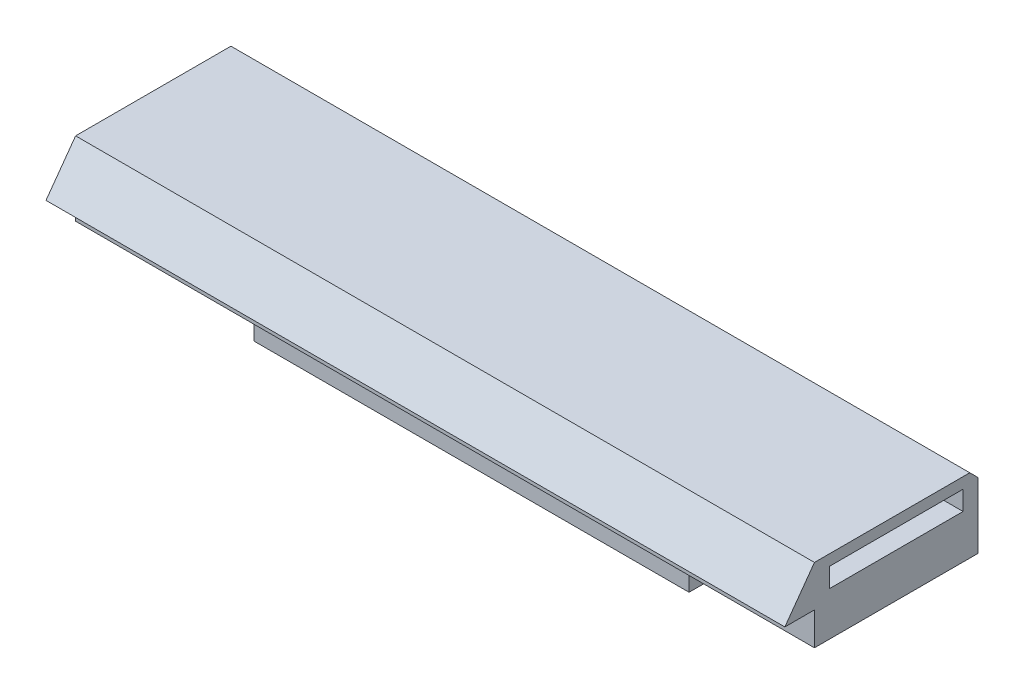
ISO-10303-21;
HEADER;
FILE_DESCRIPTION(('STEP AP214'),'2;1');
FILE_NAME('part.step','',(''),(''),'','','');
FILE_SCHEMA(('AUTOMOTIVE_DESIGN { 1 0 10303 214 1 1 1 1 }'));
ENDSEC;
DATA;
#1=APPLICATION_CONTEXT('core data for automotive mechanical design processes');
#2=APPLICATION_PROTOCOL_DEFINITION('international standard','automotive_design',2000,#1);
#3=PRODUCT_CONTEXT('',#1,'mechanical');
#4=PRODUCT('Part','Part','',(#3));
#5=PRODUCT_RELATED_PRODUCT_CATEGORY('part','',(#4));
#6=PRODUCT_DEFINITION_FORMATION('','',#4);
#7=PRODUCT_DEFINITION_CONTEXT('part definition',#1,'design');
#8=PRODUCT_DEFINITION('design','',#6,#7);
#9=PRODUCT_DEFINITION_SHAPE('','',#8);
#10=(LENGTH_UNIT() NAMED_UNIT(*) SI_UNIT(.MILLI.,.METRE.));
#11=(NAMED_UNIT(*) PLANE_ANGLE_UNIT() SI_UNIT($,.RADIAN.));
#12=(NAMED_UNIT(*) SI_UNIT($,.STERADIAN.) SOLID_ANGLE_UNIT());
#13=UNCERTAINTY_MEASURE_WITH_UNIT(LENGTH_MEASURE(1.E-05),#10,'distance_accuracy_value','');
#14=(GEOMETRIC_REPRESENTATION_CONTEXT(3) GLOBAL_UNCERTAINTY_ASSIGNED_CONTEXT((#13)) GLOBAL_UNIT_ASSIGNED_CONTEXT((#10,
#11,#12)) REPRESENTATION_CONTEXT('',''));
#15=CARTESIAN_POINT('',(0.,0.,0.));
#16=DIRECTION('',(0.,0.,1.));
#17=DIRECTION('',(1.,0.,0.));
#18=AXIS2_PLACEMENT_3D('',#15,#16,#17);
#19=CARTESIAN_POINT('',(-4.405,0.632503647479849,-0.81345422005245));
#20=DIRECTION('',(0.,0.,-1.));
#21=DIRECTION('',(-1.,0.,0.));
#22=AXIS2_PLACEMENT_3D('',#19,#20,#21);
#23=PLANE('',#22);
#24=DIRECTION('',(1.,0.,0.));
#25=VECTOR('',#24,1.);
#26=CARTESIAN_POINT('',(-4.405,0.867496352520151,-0.81345422005245));
#27=LINE('',#26,#25);
#28=CARTESIAN_POINT('',(2.3733449145523,0.867496352520151,-0.81345422005245));
#29=VERTEX_POINT('',#28);
#30=CARTESIAN_POINT('',(4.495,0.867496352520151,-0.81345422005245));
#31=VERTEX_POINT('',#30);
#32=EDGE_CURVE('E240',#29,#31,#27,.T.);
#33=ORIENTED_EDGE('',*,*,#32,.F.);
#34=DIRECTION('',(0.,-1.,0.));
#35=VECTOR('',#34,1.);
#36=CARTESIAN_POINT('',(2.3733449145523,0.632503647479849,-0.81345422005245));
#37=LINE('',#36,#35);
#38=CARTESIAN_POINT('',(2.3733449145523,0.632503647479849,-0.81345422005245));
#39=VERTEX_POINT('',#38);
#40=EDGE_CURVE('E486',#29,#39,#37,.T.);
#41=ORIENTED_EDGE('',*,*,#40,.T.);
#42=DIRECTION('',(1.,0.,0.));
#43=VECTOR('',#42,1.);
#44=CARTESIAN_POINT('',(-4.405,0.632503647479849,-0.81345422005245));
#45=LINE('',#44,#43);
#46=CARTESIAN_POINT('',(4.495,0.632503647479849,-0.81345422005245));
#47=VERTEX_POINT('',#46);
#48=EDGE_CURVE('E427',#39,#47,#45,.T.);
#49=ORIENTED_EDGE('',*,*,#48,.T.);
#50=DIRECTION('',(0.,1.,0.));
#51=VECTOR('',#50,1.);
#52=CARTESIAN_POINT('',(4.495,0.632503647479849,-0.81345422005245));
#53=LINE('',#52,#51);
#54=EDGE_CURVE('E456',#47,#31,#53,.T.);
#55=ORIENTED_EDGE('',*,*,#54,.T.);
#56=EDGE_LOOP('',(#33,#41,#49,#55));
#57=FACE_BOUND('',#56,.T.);
#58=ADVANCED_FACE('F42',(#57),#23,.F.);
#59=CARTESIAN_POINT('',(-4.405,0.632503647479849,0.81345422005245));
#60=DIRECTION('',(0.,-1.,0.));
#61=DIRECTION('',(0.,0.,-1.));
#62=AXIS2_PLACEMENT_3D('',#59,#60,#61);
#63=PLANE('',#62);
#64=ORIENTED_EDGE('',*,*,#48,.F.);
#65=DIRECTION('',(0.,0.,1.));
#66=VECTOR('',#65,1.);
#67=CARTESIAN_POINT('',(2.3733449145523,0.632503647479849,0.81345422005245));
#68=LINE('',#67,#66);
#69=CARTESIAN_POINT('',(2.3733449145523,0.632503647479849,0.81345422005245));
#70=VERTEX_POINT('',#69);
#71=EDGE_CURVE('E490',#39,#70,#68,.T.);
#72=ORIENTED_EDGE('',*,*,#71,.T.);
#73=DIRECTION('',(1.,0.,0.));
#74=VECTOR('',#73,1.);
#75=CARTESIAN_POINT('',(-4.405,0.632503647479849,0.81345422005245));
#76=LINE('',#75,#74);
#77=CARTESIAN_POINT('',(4.495,0.632503647479849,0.81345422005245));
#78=VERTEX_POINT('',#77);
#79=EDGE_CURVE('E433',#70,#78,#76,.T.);
#80=ORIENTED_EDGE('',*,*,#79,.T.);
#81=DIRECTION('',(0.,0.,-1.));
#82=VECTOR('',#81,1.);
#83=CARTESIAN_POINT('',(4.495,0.632503647479849,0.81345422005245));
#84=LINE('',#83,#82);
#85=EDGE_CURVE('E450',#78,#47,#84,.T.);
#86=ORIENTED_EDGE('',*,*,#85,.T.);
#87=EDGE_LOOP('',(#64,#72,#80,#86));
#88=FACE_BOUND('',#87,.T.);
#89=ADVANCED_FACE('F475',(#88),#63,.F.);
#90=CARTESIAN_POINT('',(-4.405,0.632503647479849,0.81345422005245));
#91=DIRECTION('',(0.,0.,1.));
#92=DIRECTION('',(1.,0.,0.));
#93=AXIS2_PLACEMENT_3D('',#90,#91,#92);
#94=PLANE('',#93);
#95=ORIENTED_EDGE('',*,*,#79,.F.);
#96=DIRECTION('',(0.,1.,0.));
#97=VECTOR('',#96,1.);
#98=CARTESIAN_POINT('',(2.3733449145523,0.632503647479849,0.81345422005245));
#99=LINE('',#98,#97);
#100=CARTESIAN_POINT('',(2.3733449145523,0.867496352520151,0.81345422005245));
#101=VERTEX_POINT('',#100);
#102=EDGE_CURVE('E231',#70,#101,#99,.T.);
#103=ORIENTED_EDGE('',*,*,#102,.T.);
#104=DIRECTION('',(1.,0.,0.));
#105=VECTOR('',#104,1.);
#106=CARTESIAN_POINT('',(-4.405,0.867496352520151,0.81345422005245));
#107=LINE('',#106,#105);
#108=CARTESIAN_POINT('',(4.495,0.867496352520151,0.81345422005245));
#109=VERTEX_POINT('',#108);
#110=EDGE_CURVE('E239',#101,#109,#107,.T.);
#111=ORIENTED_EDGE('',*,*,#110,.T.);
#112=DIRECTION('',(0.,-1.,0.));
#113=VECTOR('',#112,1.);
#114=CARTESIAN_POINT('',(4.495,0.632503647479849,0.81345422005245));
#115=LINE('',#114,#113);
#116=EDGE_CURVE('E465',#109,#78,#115,.T.);
#117=ORIENTED_EDGE('',*,*,#116,.T.);
#118=EDGE_LOOP('',(#95,#103,#111,#117));
#119=FACE_BOUND('',#118,.T.);
#120=ADVANCED_FACE('F565',(#119),#94,.F.);
#121=CARTESIAN_POINT('',(-4.405,0.867496352520151,0.81345422005245));
#122=DIRECTION('',(0.,1.,0.));
#123=DIRECTION('',(0.,0.,1.));
#124=AXIS2_PLACEMENT_3D('',#121,#122,#123);
#125=PLANE('',#124);
#126=ORIENTED_EDGE('',*,*,#110,.F.);
#127=DIRECTION('',(0.,0.,-1.));
#128=VECTOR('',#127,1.);
#129=CARTESIAN_POINT('',(2.3733449145523,0.867496352520151,0.81345422005245));
#130=LINE('',#129,#128);
#131=EDGE_CURVE('E220',#101,#29,#130,.T.);
#132=ORIENTED_EDGE('',*,*,#131,.T.);
#133=ORIENTED_EDGE('',*,*,#32,.T.);
#134=DIRECTION('',(0.,0.,1.));
#135=VECTOR('',#134,1.);
#136=CARTESIAN_POINT('',(4.495,0.867496352520151,0.81345422005245));
#137=LINE('',#136,#135);
#138=EDGE_CURVE('E460',#31,#109,#137,.T.);
#139=ORIENTED_EDGE('',*,*,#138,.T.);
#140=EDGE_LOOP('',(#126,#132,#133,#139));
#141=FACE_BOUND('',#140,.T.);
#142=ADVANCED_FACE('F583',(#141),#125,.F.);
#143=CARTESIAN_POINT('',(-4.495,1.,0.995));
#144=DIRECTION('',(0.,0.,-1.));
#145=DIRECTION('',(-1.,0.,0.));
#146=AXIS2_PLACEMENT_3D('',#143,#144,#145);
#147=PLANE('',#146);
#148=DIRECTION('',(0.,-1.,0.));
#149=VECTOR('',#148,1.);
#150=CARTESIAN_POINT('',(-4.495,1.,0.995));
#151=LINE('',#150,#149);
#152=CARTESIAN_POINT('',(-4.495,0.5,0.995));
#153=VERTEX_POINT('',#152);
#154=CARTESIAN_POINT('',(-4.495,0.1,0.995));
#155=VERTEX_POINT('',#154);
#156=EDGE_CURVE('E285',#153,#155,#151,.T.);
#157=ORIENTED_EDGE('',*,*,#156,.T.);
#158=DIRECTION('',(1.,0.,0.));
#159=VECTOR('',#158,1.);
#160=CARTESIAN_POINT('',(4.495,0.1,0.995));
#161=LINE('',#160,#159);
#162=CARTESIAN_POINT('',(4.495,0.1,0.995));
#163=VERTEX_POINT('',#162);
#164=EDGE_CURVE('E369',#155,#163,#161,.T.);
#165=ORIENTED_EDGE('',*,*,#164,.T.);
#166=DIRECTION('',(0.,-1.,0.));
#167=VECTOR('',#166,1.);
#168=CARTESIAN_POINT('',(4.495,1.,0.995));
#169=LINE('',#168,#167);
#170=CARTESIAN_POINT('',(4.495,0.5,0.995));
#171=VERTEX_POINT('',#170);
#172=EDGE_CURVE('E281',#171,#163,#169,.T.);
#173=ORIENTED_EDGE('',*,*,#172,.F.);
#174=DIRECTION('',(1.,0.,0.));
#175=VECTOR('',#174,1.);
#176=CARTESIAN_POINT('',(-4.495,0.5,0.995));
#177=LINE('',#176,#175);
#178=EDGE_CURVE('E266',#153,#171,#177,.T.);
#179=ORIENTED_EDGE('',*,*,#178,.F.);
#180=EDGE_LOOP('',(#157,#165,#173,#179));
#181=FACE_BOUND('',#180,.T.);
#182=ADVANCED_FACE('F596',(#181),#147,.F.);
#183=CARTESIAN_POINT('',(4.495,1.,0.995));
#184=DIRECTION('',(-1.,0.,0.));
#185=DIRECTION('',(0.,0.,1.));
#186=AXIS2_PLACEMENT_3D('',#183,#184,#185);
#187=PLANE('',#186);
#188=ORIENTED_EDGE('',*,*,#138,.F.);
#189=ORIENTED_EDGE('',*,*,#54,.F.);
#190=ORIENTED_EDGE('',*,*,#85,.F.);
#191=ORIENTED_EDGE('',*,*,#116,.F.);
#192=EDGE_LOOP('',(#188,#189,#190,#191));
#193=FACE_BOUND('',#192,.T.);
#194=DIRECTION('',(0.,-1.,0.));
#195=VECTOR('',#194,1.);
#196=CARTESIAN_POINT('',(4.495,1.,-0.995));
#197=LINE('',#196,#195);
#198=CARTESIAN_POINT('',(4.495,0.899999999999999,-0.995));
#199=VERTEX_POINT('',#198);
#200=CARTESIAN_POINT('',(4.495,0.1,-0.995));
#201=VERTEX_POINT('',#200);
#202=EDGE_CURVE('E221',#199,#201,#197,.T.);
#203=ORIENTED_EDGE('',*,*,#202,.F.);
#204=DIRECTION('',(0.,-0.707106781186548,-0.707106781186548));
#205=VECTOR('',#204,1.);
#206=CARTESIAN_POINT('',(4.495,1.,-0.894999999999999));
#207=LINE('',#206,#205);
#208=CARTESIAN_POINT('',(4.495,1.,-0.894999999999999));
#209=VERTEX_POINT('',#208);
#210=EDGE_CURVE('E11',#199,#209,#207,.F.);
#211=ORIENTED_EDGE('',*,*,#210,.T.);
#212=DIRECTION('',(0.,0.,-1.));
#213=VECTOR('',#212,1.);
#214=CARTESIAN_POINT('',(4.495,1.,0.995));
#215=LINE('',#214,#213);
#216=CARTESIAN_POINT('',(4.495,1.,0.995));
#217=VERTEX_POINT('',#216);
#218=EDGE_CURVE('E269',#217,#209,#215,.T.);
#219=ORIENTED_EDGE('',*,*,#218,.F.);
#220=DIRECTION('',(0.,-0.811516181908999,0.584329946605376));
#221=VECTOR('',#220,1.);
#222=CARTESIAN_POINT('',(4.495,0.5,1.3550235951123));
#223=LINE('',#222,#221);
#224=CARTESIAN_POINT('',(4.495,0.5,1.3550235951123));
#225=VERTEX_POINT('',#224);
#226=EDGE_CURVE('E259',#217,#225,#223,.T.);
#227=ORIENTED_EDGE('',*,*,#226,.T.);
#228=DIRECTION('',(0.,0.,-1.));
#229=VECTOR('',#228,1.);
#230=CARTESIAN_POINT('',(4.495,0.5,0.995));
#231=LINE('',#230,#229);
#232=EDGE_CURVE('E254',#225,#171,#231,.T.);
#233=ORIENTED_EDGE('',*,*,#232,.T.);
#234=ORIENTED_EDGE('',*,*,#172,.T.);
#235=DIRECTION('',(0.,0.,-1.));
#236=VECTOR('',#235,1.);
#237=CARTESIAN_POINT('',(4.495,0.1,-0.995));
#238=LINE('',#237,#236);
#239=EDGE_CURVE('E372',#163,#201,#238,.T.);
#240=ORIENTED_EDGE('',*,*,#239,.T.);
#241=EDGE_LOOP('',(#203,#211,#219,#227,#233,#234,#240));
#242=FACE_BOUND('',#241,.T.);
#243=ADVANCED_FACE('F481',(#193,#242),#187,.F.);
#244=CARTESIAN_POINT('',(-4.495,1.,-0.995));
#245=DIRECTION('',(0.,0.,1.));
#246=DIRECTION('',(1.,0.,0.));
#247=AXIS2_PLACEMENT_3D('',#244,#245,#246);
#248=PLANE('',#247);
#249=DIRECTION('',(0.,-1.,0.));
#250=VECTOR('',#249,1.);
#251=CARTESIAN_POINT('',(-4.495,1.,-0.995));
#252=LINE('',#251,#250);
#253=CARTESIAN_POINT('',(-4.495,0.899999999999999,-0.995));
#254=VERTEX_POINT('',#253);
#255=CARTESIAN_POINT('',(-4.495,0.1,-0.995));
#256=VERTEX_POINT('',#255);
#257=EDGE_CURVE('E289',#254,#256,#252,.T.);
#258=ORIENTED_EDGE('',*,*,#257,.F.);
#259=DIRECTION('',(1.,0.,0.));
#260=VECTOR('',#259,1.);
#261=CARTESIAN_POINT('',(-4.495,0.899999999999999,-0.995));
#262=LINE('',#261,#260);
#263=EDGE_CURVE('E53',#254,#199,#262,.T.);
#264=ORIENTED_EDGE('',*,*,#263,.T.);
#265=ORIENTED_EDGE('',*,*,#202,.T.);
#266=DIRECTION('',(-1.,0.,0.));
#267=VECTOR('',#266,1.);
#268=CARTESIAN_POINT('',(-4.495,0.1,-0.995));
#269=LINE('',#268,#267);
#270=EDGE_CURVE('E336',#201,#256,#269,.T.);
#271=ORIENTED_EDGE('',*,*,#270,.T.);
#272=EDGE_LOOP('',(#258,#264,#265,#271));
#273=FACE_BOUND('',#272,.T.);
#274=ADVANCED_FACE('F660',(#273),#248,.F.);
#275=CARTESIAN_POINT('',(-4.495,1.,0.995));
#276=DIRECTION('',(1.,0.,0.));
#277=DIRECTION('',(0.,0.,-1.));
#278=AXIS2_PLACEMENT_3D('',#275,#276,#277);
#279=PLANE('',#278);
#280=DIRECTION('',(0.,0.,1.));
#281=VECTOR('',#280,1.);
#282=CARTESIAN_POINT('',(-4.495,1.,0.995));
#283=LINE('',#282,#281);
#284=CARTESIAN_POINT('',(-4.495,1.,-0.894999999999999));
#285=VERTEX_POINT('',#284);
#286=CARTESIAN_POINT('',(-4.495,1.,0.995));
#287=VERTEX_POINT('',#286);
#288=EDGE_CURVE('E275',#285,#287,#283,.T.);
#289=ORIENTED_EDGE('',*,*,#288,.F.);
#290=DIRECTION('',(0.,0.707106781186548,0.707106781186548));
#291=VECTOR('',#290,1.);
#292=CARTESIAN_POINT('',(-4.495,1.,-0.894999999999999));
#293=LINE('',#292,#291);
#294=EDGE_CURVE('E67',#285,#254,#293,.F.);
#295=ORIENTED_EDGE('',*,*,#294,.T.);
#296=ORIENTED_EDGE('',*,*,#257,.T.);
#297=DIRECTION('',(0.,0.,1.));
#298=VECTOR('',#297,1.);
#299=CARTESIAN_POINT('',(-4.495,0.1,0.995));
#300=LINE('',#299,#298);
#301=EDGE_CURVE('E366',#256,#155,#300,.T.);
#302=ORIENTED_EDGE('',*,*,#301,.T.);
#303=ORIENTED_EDGE('',*,*,#156,.F.);
#304=DIRECTION('',(0.,0.,-1.));
#305=VECTOR('',#304,1.);
#306=CARTESIAN_POINT('',(-4.495,0.5,0.995));
#307=LINE('',#306,#305);
#308=CARTESIAN_POINT('',(-4.495,0.5,1.3550235951123));
#309=VERTEX_POINT('',#308);
#310=EDGE_CURVE('E253',#309,#153,#307,.T.);
#311=ORIENTED_EDGE('',*,*,#310,.F.);
#312=DIRECTION('',(0.,-0.811516181908999,0.584329946605376));
#313=VECTOR('',#312,1.);
#314=CARTESIAN_POINT('',(-4.495,0.5,1.3550235951123));
#315=LINE('',#314,#313);
#316=EDGE_CURVE('E249',#287,#309,#315,.T.);
#317=ORIENTED_EDGE('',*,*,#316,.F.);
#318=EDGE_LOOP('',(#289,#295,#296,#302,#303,#311,#317));
#319=FACE_BOUND('',#318,.T.);
#320=ADVANCED_FACE('F556',(#319),#279,.F.);
#321=CARTESIAN_POINT('',(0.,1.,0.));
#322=DIRECTION('',(0.,-1.,0.));
#323=DIRECTION('',(0.,0.,-1.));
#324=AXIS2_PLACEMENT_3D('',#321,#322,#323);
#325=PLANE('',#324);
#326=ORIENTED_EDGE('',*,*,#218,.T.);
#327=DIRECTION('',(-1.,0.,0.));
#328=VECTOR('',#327,1.);
#329=CARTESIAN_POINT('',(0.,1.,-0.894999999999999));
#330=LINE('',#329,#328);
#331=EDGE_CURVE('E376',#209,#285,#330,.T.);
#332=ORIENTED_EDGE('',*,*,#331,.T.);
#333=ORIENTED_EDGE('',*,*,#288,.T.);
#334=DIRECTION('',(1.,0.,0.));
#335=VECTOR('',#334,1.);
#336=CARTESIAN_POINT('',(-4.495,1.,0.995));
#337=LINE('',#336,#335);
#338=EDGE_CURVE('E278',#287,#217,#337,.T.);
#339=ORIENTED_EDGE('',*,*,#338,.T.);
#340=EDGE_LOOP('',(#326,#332,#333,#339));
#341=FACE_BOUND('',#340,.T.);
#342=ADVANCED_FACE('F546',(#341),#325,.F.);
#343=CARTESIAN_POINT('',(0.,0.,0.));
#344=DIRECTION('',(0.,-1.,0.));
#345=DIRECTION('',(0.,0.,-1.));
#346=AXIS2_PLACEMENT_3D('',#343,#344,#345);
#347=PLANE('',#346);
#348=DIRECTION('',(0.,0.,-1.));
#349=VECTOR('',#348,1.);
#350=CARTESIAN_POINT('',(-4.395,0.,-0.995));
#351=LINE('',#350,#349);
#352=CARTESIAN_POINT('',(-4.395,0.,0.895));
#353=VERTEX_POINT('',#352);
#354=CARTESIAN_POINT('',(-4.395,0.,-0.895));
#355=VERTEX_POINT('',#354);
#356=EDGE_CURVE('E359',#353,#355,#351,.T.);
#357=ORIENTED_EDGE('',*,*,#356,.T.);
#358=DIRECTION('',(1.,0.,0.));
#359=VECTOR('',#358,1.);
#360=CARTESIAN_POINT('',(4.495,0.,-0.895));
#361=LINE('',#360,#359);
#362=CARTESIAN_POINT('',(4.395,0.,-0.895));
#363=VERTEX_POINT('',#362);
#364=EDGE_CURVE('E362',#355,#363,#361,.T.);
#365=ORIENTED_EDGE('',*,*,#364,.T.);
#366=DIRECTION('',(0.,0.,1.));
#367=VECTOR('',#366,1.);
#368=CARTESIAN_POINT('',(4.395,0.,0.995));
#369=LINE('',#368,#367);
#370=CARTESIAN_POINT('',(4.395,0.,0.895));
#371=VERTEX_POINT('',#370);
#372=EDGE_CURVE('E353',#363,#371,#369,.T.);
#373=ORIENTED_EDGE('',*,*,#372,.T.);
#374=DIRECTION('',(-1.,0.,0.));
#375=VECTOR('',#374,1.);
#376=CARTESIAN_POINT('',(-4.495,0.,0.895));
#377=LINE('',#376,#375);
#378=EDGE_CURVE('E356',#371,#353,#377,.T.);
#379=ORIENTED_EDGE('',*,*,#378,.T.);
#380=EDGE_LOOP('',(#357,#365,#373,#379));
#381=FACE_BOUND('',#380,.T.);
#382=DIRECTION('',(0.,0.,1.));
#383=VECTOR('',#382,1.);
#384=CARTESIAN_POINT('',(-2.74685589781037,0.,0.));
#385=LINE('',#384,#383);
#386=CARTESIAN_POINT('',(-2.74685589781037,0.,-0.77245516157822));
#387=VERTEX_POINT('',#386);
#388=CARTESIAN_POINT('',(-2.74685589781037,0.,0.77245516157822));
#389=VERTEX_POINT('',#388);
#390=EDGE_CURVE('E346',#387,#389,#385,.T.);
#391=ORIENTED_EDGE('',*,*,#390,.T.);
#392=DIRECTION('',(1.,0.,0.));
#393=VECTOR('',#392,1.);
#394=CARTESIAN_POINT('',(0.,0.,0.77245516157822));
#395=LINE('',#394,#393);
#396=CARTESIAN_POINT('',(2.74685589781037,0.,0.77245516157822));
#397=VERTEX_POINT('',#396);
#398=EDGE_CURVE('E349',#389,#397,#395,.T.);
#399=ORIENTED_EDGE('',*,*,#398,.T.);
#400=DIRECTION('',(0.,0.,-1.));
#401=VECTOR('',#400,1.);
#402=CARTESIAN_POINT('',(2.74685589781037,0.,0.));
#403=LINE('',#402,#401);
#404=CARTESIAN_POINT('',(2.74685589781037,0.,-0.77245516157822));
#405=VERTEX_POINT('',#404);
#406=EDGE_CURVE('E340',#397,#405,#403,.T.);
#407=ORIENTED_EDGE('',*,*,#406,.T.);
#408=DIRECTION('',(-1.,0.,0.));
#409=VECTOR('',#408,1.);
#410=CARTESIAN_POINT('',(0.,0.,-0.77245516157822));
#411=LINE('',#410,#409);
#412=EDGE_CURVE('E343',#405,#387,#411,.T.);
#413=ORIENTED_EDGE('',*,*,#412,.T.);
#414=EDGE_LOOP('',(#391,#399,#407,#413));
#415=FACE_BOUND('',#414,.T.);
#416=ADVANCED_FACE('F543',(#381,#415),#347,.T.);
#417=CARTESIAN_POINT('',(-4.495,0.5,0.995));
#418=DIRECTION('',(0.,-1.,0.));
#419=DIRECTION('',(0.,0.,-1.));
#420=AXIS2_PLACEMENT_3D('',#417,#418,#419);
#421=PLANE('',#420);
#422=ORIENTED_EDGE('',*,*,#232,.F.);
#423=DIRECTION('',(1.,0.,0.));
#424=VECTOR('',#423,1.);
#425=CARTESIAN_POINT('',(-4.495,0.5,1.3550235951123));
#426=LINE('',#425,#424);
#427=EDGE_CURVE('E258',#309,#225,#426,.T.);
#428=ORIENTED_EDGE('',*,*,#427,.F.);
#429=ORIENTED_EDGE('',*,*,#310,.T.);
#430=ORIENTED_EDGE('',*,*,#178,.T.);
#431=EDGE_LOOP('',(#422,#428,#429,#430));
#432=FACE_BOUND('',#431,.T.);
#433=ADVANCED_FACE('F545',(#432),#421,.T.);
#434=CARTESIAN_POINT('',(-4.495,0.5,1.3550235951123));
#435=DIRECTION('',(0.,0.584329946605376,0.811516181908999));
#436=DIRECTION('',(0.,-0.811516181908999,0.584329946605376));
#437=AXIS2_PLACEMENT_3D('',#434,#435,#436);
#438=PLANE('',#437);
#439=ORIENTED_EDGE('',*,*,#226,.F.);
#440=ORIENTED_EDGE('',*,*,#338,.F.);
#441=ORIENTED_EDGE('',*,*,#316,.T.);
#442=ORIENTED_EDGE('',*,*,#427,.T.);
#443=EDGE_LOOP('',(#439,#440,#441,#442));
#444=FACE_BOUND('',#443,.T.);
#445=ADVANCED_FACE('F553',(#444),#438,.T.);
#446=CARTESIAN_POINT('',(2.64685589781037,-0.5,-0.672455161578218));
#447=DIRECTION('',(-1.,0.,0.));
#448=DIRECTION('',(0.,0.,1.));
#449=AXIS2_PLACEMENT_3D('',#446,#447,#448);
#450=PLANE('',#449);
#451=DIRECTION('',(0.,1.,0.));
#452=VECTOR('',#451,1.);
#453=CARTESIAN_POINT('',(2.64685589781037,-0.5,0.672455161578218));
#454=LINE('',#453,#452);
#455=CARTESIAN_POINT('',(2.64685589781037,-0.4,0.672455161578218));
#456=VERTEX_POINT('',#455);
#457=CARTESIAN_POINT('',(2.64685589781037,-0.100000000000002,0.672455161578218));
#458=VERTEX_POINT('',#457);
#459=EDGE_CURVE('E461',#456,#458,#454,.T.);
#460=ORIENTED_EDGE('',*,*,#459,.F.);
#461=DIRECTION('',(0.,0.,-1.));
#462=VECTOR('',#461,1.);
#463=CARTESIAN_POINT('',(2.64685589781037,-0.4,-0.672455161578218));
#464=LINE('',#463,#462);
#465=CARTESIAN_POINT('',(2.64685589781037,-0.4,-0.672455161578218));
#466=VERTEX_POINT('',#465);
#467=EDGE_CURVE('E333',#456,#466,#464,.T.);
#468=ORIENTED_EDGE('',*,*,#467,.T.);
#469=DIRECTION('',(0.,1.,0.));
#470=VECTOR('',#469,1.);
#471=CARTESIAN_POINT('',(2.64685589781037,-0.5,-0.672455161578218));
#472=LINE('',#471,#470);
#473=CARTESIAN_POINT('',(2.64685589781037,-0.100000000000002,-0.672455161578218));
#474=VERTEX_POINT('',#473);
#475=EDGE_CURVE('E489',#466,#474,#472,.T.);
#476=ORIENTED_EDGE('',*,*,#475,.T.);
#477=DIRECTION('',(0.,0.,1.));
#478=VECTOR('',#477,1.);
#479=CARTESIAN_POINT('',(2.64685589781037,-0.100000000000002,-0.672455161578218));
#480=LINE('',#479,#478);
#481=EDGE_CURVE('E330',#474,#458,#480,.T.);
#482=ORIENTED_EDGE('',*,*,#481,.T.);
#483=EDGE_LOOP('',(#460,#468,#476,#482));
#484=FACE_BOUND('',#483,.T.);
#485=ADVANCED_FACE('F585',(#484),#450,.F.);
#486=CARTESIAN_POINT('',(-2.64685589781037,-0.5,0.672455161578218));
#487=DIRECTION('',(0.,0.,-1.));
#488=DIRECTION('',(-1.,0.,0.));
#489=AXIS2_PLACEMENT_3D('',#486,#487,#488);
#490=PLANE('',#489);
#491=DIRECTION('',(0.,1.,0.));
#492=VECTOR('',#491,1.);
#493=CARTESIAN_POINT('',(-2.64685589781037,-0.5,0.672455161578218));
#494=LINE('',#493,#492);
#495=CARTESIAN_POINT('',(-2.64685589781037,-0.4,0.672455161578218));
#496=VERTEX_POINT('',#495);
#497=CARTESIAN_POINT('',(-2.64685589781037,-0.100000000000002,0.672455161578218));
#498=VERTEX_POINT('',#497);
#499=EDGE_CURVE('E503',#496,#498,#494,.T.);
#500=ORIENTED_EDGE('',*,*,#499,.F.);
#501=DIRECTION('',(1.,0.,0.));
#502=VECTOR('',#501,1.);
#503=CARTESIAN_POINT('',(-2.64685589781037,-0.4,0.672455161578218));
#504=LINE('',#503,#502);
#505=EDGE_CURVE('E327',#496,#456,#504,.T.);
#506=ORIENTED_EDGE('',*,*,#505,.T.);
#507=ORIENTED_EDGE('',*,*,#459,.T.);
#508=DIRECTION('',(-1.,0.,0.));
#509=VECTOR('',#508,1.);
#510=CARTESIAN_POINT('',(-2.64685589781037,-0.100000000000002,0.672455161578218));
#511=LINE('',#510,#509);
#512=EDGE_CURVE('E323',#458,#498,#511,.T.);
#513=ORIENTED_EDGE('',*,*,#512,.T.);
#514=EDGE_LOOP('',(#500,#506,#507,#513));
#515=FACE_BOUND('',#514,.T.);
#516=ADVANCED_FACE('F512',(#515),#490,.F.);
#517=CARTESIAN_POINT('',(-2.64685589781037,-0.5,-0.672455161578218));
#518=DIRECTION('',(1.,0.,0.));
#519=DIRECTION('',(0.,0.,-1.));
#520=AXIS2_PLACEMENT_3D('',#517,#518,#519);
#521=PLANE('',#520);
#522=DIRECTION('',(0.,1.,0.));
#523=VECTOR('',#522,1.);
#524=CARTESIAN_POINT('',(-2.64685589781037,-0.5,-0.672455161578218));
#525=LINE('',#524,#523);
#526=CARTESIAN_POINT('',(-2.64685589781037,-0.4,-0.672455161578218));
#527=VERTEX_POINT('',#526);
#528=CARTESIAN_POINT('',(-2.64685589781037,-0.100000000000002,-0.672455161578218));
#529=VERTEX_POINT('',#528);
#530=EDGE_CURVE('E495',#527,#529,#525,.T.);
#531=ORIENTED_EDGE('',*,*,#530,.F.);
#532=DIRECTION('',(0.,0.,1.));
#533=VECTOR('',#532,1.);
#534=CARTESIAN_POINT('',(-2.64685589781037,-0.4,-0.672455161578218));
#535=LINE('',#534,#533);
#536=EDGE_CURVE('E320',#527,#496,#535,.T.);
#537=ORIENTED_EDGE('',*,*,#536,.T.);
#538=ORIENTED_EDGE('',*,*,#499,.T.);
#539=DIRECTION('',(0.,0.,-1.));
#540=VECTOR('',#539,1.);
#541=CARTESIAN_POINT('',(-2.64685589781037,-0.100000000000002,-0.672455161578218));
#542=LINE('',#541,#540);
#543=EDGE_CURVE('E317',#498,#529,#542,.T.);
#544=ORIENTED_EDGE('',*,*,#543,.T.);
#545=EDGE_LOOP('',(#531,#537,#538,#544));
#546=FACE_BOUND('',#545,.T.);
#547=ADVANCED_FACE('F532',(#546),#521,.F.);
#548=CARTESIAN_POINT('',(-2.64685589781037,-0.5,-0.672455161578218));
#549=DIRECTION('',(0.,0.,1.));
#550=DIRECTION('',(1.,0.,0.));
#551=AXIS2_PLACEMENT_3D('',#548,#549,#550);
#552=PLANE('',#551);
#553=ORIENTED_EDGE('',*,*,#475,.F.);
#554=DIRECTION('',(-1.,0.,0.));
#555=VECTOR('',#554,1.);
#556=CARTESIAN_POINT('',(-2.64685589781037,-0.4,-0.672455161578218));
#557=LINE('',#556,#555);
#558=EDGE_CURVE('E313',#466,#527,#557,.T.);
#559=ORIENTED_EDGE('',*,*,#558,.T.);
#560=ORIENTED_EDGE('',*,*,#530,.T.);
#561=DIRECTION('',(1.,0.,0.));
#562=VECTOR('',#561,1.);
#563=CARTESIAN_POINT('',(-2.64685589781037,-0.100000000000002,-0.672455161578218));
#564=LINE('',#563,#562);
#565=EDGE_CURVE('E310',#529,#474,#564,.T.);
#566=ORIENTED_EDGE('',*,*,#565,.T.);
#567=EDGE_LOOP('',(#553,#559,#560,#566));
#568=FACE_BOUND('',#567,.T.);
#569=ADVANCED_FACE('F536',(#568),#552,.F.);
#570=CARTESIAN_POINT('',(0.,-0.5,0.));
#571=DIRECTION('',(0.,1.,0.));
#572=DIRECTION('',(0.,0.,1.));
#573=AXIS2_PLACEMENT_3D('',#570,#571,#572);
#574=PLANE('',#573);
#575=DIRECTION('',(0.,0.,-1.));
#576=VECTOR('',#575,1.);
#577=CARTESIAN_POINT('',(-2.54685589781037,-0.5,0.));
#578=LINE('',#577,#576);
#579=CARTESIAN_POINT('',(-2.54685589781037,-0.5,0.572455161578218));
#580=VERTEX_POINT('',#579);
#581=CARTESIAN_POINT('',(-2.54685589781037,-0.5,-0.572455161578218));
#582=VERTEX_POINT('',#581);
#583=EDGE_CURVE('E303',#580,#582,#578,.T.);
#584=ORIENTED_EDGE('',*,*,#583,.T.);
#585=DIRECTION('',(1.,0.,0.));
#586=VECTOR('',#585,1.);
#587=CARTESIAN_POINT('',(0.,-0.5,-0.572455161578218));
#588=LINE('',#587,#586);
#589=CARTESIAN_POINT('',(2.54685589781037,-0.5,-0.572455161578218));
#590=VERTEX_POINT('',#589);
#591=EDGE_CURVE('E306',#582,#590,#588,.T.);
#592=ORIENTED_EDGE('',*,*,#591,.T.);
#593=DIRECTION('',(0.,0.,1.));
#594=VECTOR('',#593,1.);
#595=CARTESIAN_POINT('',(2.54685589781037,-0.5,0.));
#596=LINE('',#595,#594);
#597=CARTESIAN_POINT('',(2.54685589781037,-0.5,0.572455161578218));
#598=VERTEX_POINT('',#597);
#599=EDGE_CURVE('E297',#590,#598,#596,.T.);
#600=ORIENTED_EDGE('',*,*,#599,.T.);
#601=DIRECTION('',(-1.,0.,0.));
#602=VECTOR('',#601,1.);
#603=CARTESIAN_POINT('',(0.,-0.5,0.572455161578218));
#604=LINE('',#603,#602);
#605=EDGE_CURVE('E300',#598,#580,#604,.T.);
#606=ORIENTED_EDGE('',*,*,#605,.T.);
#607=EDGE_LOOP('',(#584,#592,#600,#606));
#608=FACE_BOUND('',#607,.T.);
#609=ADVANCED_FACE('F608',(#608),#574,.F.);
#610=CARTESIAN_POINT('',(2.3733449145523,0.5,0.995));
#611=DIRECTION('',(1.,0.,0.));
#612=DIRECTION('',(0.,0.,-1.));
#613=AXIS2_PLACEMENT_3D('',#610,#611,#612);
#614=PLANE('',#613);
#615=ORIENTED_EDGE('',*,*,#40,.F.);
#616=ORIENTED_EDGE('',*,*,#131,.F.);
#617=ORIENTED_EDGE('',*,*,#102,.F.);
#618=ORIENTED_EDGE('',*,*,#71,.F.);
#619=EDGE_LOOP('',(#615,#616,#617,#618));
#620=FACE_BOUND('',#619,.T.);
#621=ADVANCED_FACE('F600',(#620),#614,.T.);
#622=CARTESIAN_POINT('',(0.,-0.5,0.572455161578218));
#623=DIRECTION('',(0.,0.707106781186547,-0.707106781186547));
#624=DIRECTION('',(-1.,0.,0.));
#625=AXIS2_PLACEMENT_3D('',#622,#623,#624);
#626=PLANE('',#625);
#627=DIRECTION('',(-0.577350269189626,-0.577350269189626,-0.577350269189626));
#628=VECTOR('',#627,1.);
#629=CARTESIAN_POINT('',(2.35603751061763,-0.690818387192739,0.381636774385479));
#630=LINE('',#629,#628);
#631=EDGE_CURVE('E384',#456,#598,#630,.T.);
#632=ORIENTED_EDGE('',*,*,#631,.F.);
#633=ORIENTED_EDGE('',*,*,#505,.F.);
#634=DIRECTION('',(0.577350269189626,-0.577350269189626,-0.577350269189626));
#635=VECTOR('',#634,1.);
#636=CARTESIAN_POINT('',(-1.69790393187358,-1.34895196593679,-0.276496804358572));
#637=LINE('',#636,#635);
#638=EDGE_CURVE('E388',#580,#496,#637,.F.);
#639=ORIENTED_EDGE('',*,*,#638,.F.);
#640=ORIENTED_EDGE('',*,*,#605,.F.);
#641=EDGE_LOOP('',(#632,#633,#639,#640));
#642=FACE_BOUND('',#641,.T.);
#643=ADVANCED_FACE('F607',(#642),#626,.F.);
#644=CARTESIAN_POINT('',(-2.54685589781037,-0.5,0.));
#645=DIRECTION('',(0.707106781186547,0.707106781186547,0.));
#646=DIRECTION('',(0.,0.,-1.));
#647=AXIS2_PLACEMENT_3D('',#644,#645,#646);
#648=PLANE('',#647);
#649=ORIENTED_EDGE('',*,*,#638,.T.);
#650=ORIENTED_EDGE('',*,*,#536,.F.);
#651=DIRECTION('',(0.577350269189626,-0.577350269189626,0.577350269189626));
#652=VECTOR('',#651,1.);
#653=CARTESIAN_POINT('',(-2.35603751061763,-0.690818387192739,-0.381636774385479));
#654=LINE('',#653,#652);
#655=EDGE_CURVE('E380',#582,#527,#654,.F.);
#656=ORIENTED_EDGE('',*,*,#655,.F.);
#657=ORIENTED_EDGE('',*,*,#583,.F.);
#658=EDGE_LOOP('',(#649,#650,#656,#657));
#659=FACE_BOUND('',#658,.T.);
#660=ADVANCED_FACE('F614',(#659),#648,.F.);
#661=CARTESIAN_POINT('',(2.54685589781037,-0.5,0.));
#662=DIRECTION('',(-0.707106781186547,0.707106781186547,0.));
#663=DIRECTION('',(0.,0.,1.));
#664=AXIS2_PLACEMENT_3D('',#661,#662,#663);
#665=PLANE('',#664);
#666=ORIENTED_EDGE('',*,*,#631,.T.);
#667=ORIENTED_EDGE('',*,*,#599,.F.);
#668=DIRECTION('',(0.577350269189626,0.577350269189626,-0.577350269189626));
#669=VECTOR('',#668,1.);
#670=CARTESIAN_POINT('',(2.35603751061763,-0.690818387192739,-0.381636774385479));
#671=LINE('',#670,#669);
#672=EDGE_CURVE('E377',#466,#590,#671,.F.);
#673=ORIENTED_EDGE('',*,*,#672,.F.);
#674=ORIENTED_EDGE('',*,*,#467,.F.);
#675=EDGE_LOOP('',(#666,#667,#673,#674));
#676=FACE_BOUND('',#675,.T.);
#677=ADVANCED_FACE('F834',(#676),#665,.F.);
#678=CARTESIAN_POINT('',(0.,-0.5,-0.572455161578218));
#679=DIRECTION('',(0.,0.707106781186547,0.707106781186547));
#680=DIRECTION('',(1.,0.,0.));
#681=AXIS2_PLACEMENT_3D('',#678,#679,#680);
#682=PLANE('',#681);
#683=ORIENTED_EDGE('',*,*,#655,.T.);
#684=ORIENTED_EDGE('',*,*,#558,.F.);
#685=ORIENTED_EDGE('',*,*,#672,.T.);
#686=ORIENTED_EDGE('',*,*,#591,.F.);
#687=EDGE_LOOP('',(#683,#684,#685,#686));
#688=FACE_BOUND('',#687,.T.);
#689=ADVANCED_FACE('F689',(#688),#682,.F.);
#690=CARTESIAN_POINT('',(-4.495,0.1,0.995));
#691=DIRECTION('',(0.,-0.707106781186547,0.707106781186547));
#692=DIRECTION('',(-1.,0.,0.));
#693=AXIS2_PLACEMENT_3D('',#690,#691,#692);
#694=PLANE('',#693);
#695=DIRECTION('',(0.577350269189626,-0.577350269189626,-0.577350269189626));
#696=VECTOR('',#695,1.);
#697=CARTESIAN_POINT('',(-4.495,0.1,0.995));
#698=LINE('',#697,#696);
#699=EDGE_CURVE('E400',#353,#155,#698,.F.);
#700=ORIENTED_EDGE('',*,*,#699,.F.);
#701=ORIENTED_EDGE('',*,*,#378,.F.);
#702=DIRECTION('',(-0.577350269189626,-0.577350269189626,-0.577350269189626));
#703=VECTOR('',#702,1.);
#704=CARTESIAN_POINT('',(4.495,0.1,0.995));
#705=LINE('',#704,#703);
#706=EDGE_CURVE('E381',#163,#371,#705,.T.);
#707=ORIENTED_EDGE('',*,*,#706,.F.);
#708=ORIENTED_EDGE('',*,*,#164,.F.);
#709=EDGE_LOOP('',(#700,#701,#707,#708));
#710=FACE_BOUND('',#709,.T.);
#711=ADVANCED_FACE('F650',(#710),#694,.T.);
#712=CARTESIAN_POINT('',(4.495,0.1,0.995));
#713=DIRECTION('',(0.707106781186547,-0.707106781186547,0.));
#714=DIRECTION('',(0.,0.,1.));
#715=AXIS2_PLACEMENT_3D('',#712,#713,#714);
#716=PLANE('',#715);
#717=ORIENTED_EDGE('',*,*,#706,.T.);
#718=ORIENTED_EDGE('',*,*,#372,.F.);
#719=DIRECTION('',(0.577350269189626,0.577350269189626,-0.577350269189626));
#720=VECTOR('',#719,1.);
#721=CARTESIAN_POINT('',(3.83166666666667,-0.563333333333333,-0.331666666666667));
#722=LINE('',#721,#720);
#723=EDGE_CURVE('E396',#201,#363,#722,.F.);
#724=ORIENTED_EDGE('',*,*,#723,.F.);
#725=ORIENTED_EDGE('',*,*,#239,.F.);
#726=EDGE_LOOP('',(#717,#718,#724,#725));
#727=FACE_BOUND('',#726,.T.);
#728=ADVANCED_FACE('F653',(#727),#716,.T.);
#729=CARTESIAN_POINT('',(-4.495,0.1,0.995));
#730=DIRECTION('',(-0.707106781186547,-0.707106781186547,0.));
#731=DIRECTION('',(0.,0.,-1.));
#732=AXIS2_PLACEMENT_3D('',#729,#730,#731);
#733=PLANE('',#732);
#734=ORIENTED_EDGE('',*,*,#699,.T.);
#735=ORIENTED_EDGE('',*,*,#301,.F.);
#736=DIRECTION('',(0.577350269189626,-0.577350269189626,0.577350269189626));
#737=VECTOR('',#736,1.);
#738=CARTESIAN_POINT('',(-3.83166666666667,-0.563333333333333,-0.331666666666667));
#739=LINE('',#738,#737);
#740=EDGE_CURVE('E392',#355,#256,#739,.F.);
#741=ORIENTED_EDGE('',*,*,#740,.F.);
#742=ORIENTED_EDGE('',*,*,#356,.F.);
#743=EDGE_LOOP('',(#734,#735,#741,#742));
#744=FACE_BOUND('',#743,.T.);
#745=ADVANCED_FACE('F665',(#744),#733,.T.);
#746=CARTESIAN_POINT('',(-4.495,0.1,-0.995));
#747=DIRECTION('',(0.,-0.707106781186547,-0.707106781186547));
#748=DIRECTION('',(1.,0.,0.));
#749=AXIS2_PLACEMENT_3D('',#746,#747,#748);
#750=PLANE('',#749);
#751=ORIENTED_EDGE('',*,*,#723,.T.);
#752=ORIENTED_EDGE('',*,*,#364,.F.);
#753=ORIENTED_EDGE('',*,*,#740,.T.);
#754=ORIENTED_EDGE('',*,*,#270,.F.);
#755=EDGE_LOOP('',(#751,#752,#753,#754));
#756=FACE_BOUND('',#755,.T.);
#757=ADVANCED_FACE('F657',(#756),#750,.T.);
#758=CARTESIAN_POINT('',(-2.64685589781037,-0.100000000000002,-0.672455161578218));
#759=DIRECTION('',(0.,0.707106781186544,0.707106781186551));
#760=DIRECTION('',(1.,0.,0.));
#761=AXIS2_PLACEMENT_3D('',#758,#759,#760);
#762=PLANE('',#761);
#763=DIRECTION('',(-0.577350269189624,0.577350269189629,-0.577350269189624));
#764=VECTOR('',#763,1.);
#765=CARTESIAN_POINT('',(-2.64685589781037,-0.100000000000002,-0.672455161578218));
#766=LINE('',#765,#764);
#767=EDGE_CURVE('E413',#387,#529,#766,.F.);
#768=ORIENTED_EDGE('',*,*,#767,.F.);
#769=ORIENTED_EDGE('',*,*,#412,.F.);
#770=DIRECTION('',(0.577350269189624,0.577350269189629,-0.577350269189624));
#771=VECTOR('',#770,1.);
#772=CARTESIAN_POINT('',(2.64685589781037,-0.100000000000002,-0.672455161578218));
#773=LINE('',#772,#771);
#774=EDGE_CURVE('E397',#474,#405,#773,.T.);
#775=ORIENTED_EDGE('',*,*,#774,.F.);
#776=ORIENTED_EDGE('',*,*,#565,.F.);
#777=EDGE_LOOP('',(#768,#769,#775,#776));
#778=FACE_BOUND('',#777,.T.);
#779=ADVANCED_FACE('F540',(#778),#762,.F.);
#780=CARTESIAN_POINT('',(2.64685589781037,-0.100000000000002,-0.672455161578218));
#781=DIRECTION('',(-0.707106781186551,0.707106781186544,0.));
#782=DIRECTION('',(0.,0.,1.));
#783=AXIS2_PLACEMENT_3D('',#780,#781,#782);
#784=PLANE('',#783);
#785=ORIENTED_EDGE('',*,*,#774,.T.);
#786=ORIENTED_EDGE('',*,*,#406,.F.);
#787=DIRECTION('',(-0.577350269189624,-0.577350269189629,-0.577350269189624));
#788=VECTOR('',#787,1.);
#789=CARTESIAN_POINT('',(2.19855245675823,-0.548303441052149,0.224151720526075));
#790=LINE('',#789,#788);
#791=EDGE_CURVE('E410',#458,#397,#790,.F.);
#792=ORIENTED_EDGE('',*,*,#791,.F.);
#793=ORIENTED_EDGE('',*,*,#481,.F.);
#794=EDGE_LOOP('',(#785,#786,#792,#793));
#795=FACE_BOUND('',#794,.T.);
#796=ADVANCED_FACE('F520',(#795),#784,.F.);
#797=CARTESIAN_POINT('',(-2.64685589781037,-0.100000000000002,-0.672455161578218));
#798=DIRECTION('',(0.707106781186551,0.707106781186544,0.));
#799=DIRECTION('',(0.,0.,-1.));
#800=AXIS2_PLACEMENT_3D('',#797,#798,#799);
#801=PLANE('',#800);
#802=ORIENTED_EDGE('',*,*,#767,.T.);
#803=ORIENTED_EDGE('',*,*,#543,.F.);
#804=DIRECTION('',(-0.577350269189624,0.577350269189629,0.577350269189624));
#805=VECTOR('',#804,1.);
#806=CARTESIAN_POINT('',(-2.19855245675823,-0.548303441052149,0.224151720526075));
#807=LINE('',#806,#805);
#808=EDGE_CURVE('E407',#389,#498,#807,.F.);
#809=ORIENTED_EDGE('',*,*,#808,.F.);
#810=ORIENTED_EDGE('',*,*,#390,.F.);
#811=EDGE_LOOP('',(#802,#803,#809,#810));
#812=FACE_BOUND('',#811,.T.);
#813=ADVANCED_FACE('F528',(#812),#801,.F.);
#814=CARTESIAN_POINT('',(-2.64685589781037,-0.100000000000002,0.672455161578218));
#815=DIRECTION('',(0.,0.707106781186544,-0.707106781186551));
#816=DIRECTION('',(-1.,0.,0.));
#817=AXIS2_PLACEMENT_3D('',#814,#815,#816);
#818=PLANE('',#817);
#819=ORIENTED_EDGE('',*,*,#791,.T.);
#820=ORIENTED_EDGE('',*,*,#398,.F.);
#821=ORIENTED_EDGE('',*,*,#808,.T.);
#822=ORIENTED_EDGE('',*,*,#512,.F.);
#823=EDGE_LOOP('',(#819,#820,#821,#822));
#824=FACE_BOUND('',#823,.T.);
#825=ADVANCED_FACE('F523',(#824),#818,.F.);
#826=CARTESIAN_POINT('',(0.,1.,-0.894999999999999));
#827=DIRECTION('',(0.,-0.707106781186547,0.707106781186547));
#828=DIRECTION('',(-1.,0.,0.));
#829=AXIS2_PLACEMENT_3D('',#826,#827,#828);
#830=PLANE('',#829);
#831=ORIENTED_EDGE('',*,*,#210,.F.);
#832=ORIENTED_EDGE('',*,*,#263,.F.);
#833=ORIENTED_EDGE('',*,*,#294,.F.);
#834=ORIENTED_EDGE('',*,*,#331,.F.);
#835=EDGE_LOOP('',(#831,#832,#833,#834));
#836=FACE_BOUND('',#835,.T.);
#837=ADVANCED_FACE('F45',(#836),#830,.F.);
#838=CLOSED_SHELL('',(#58,#89,#120,#142,#182,#243,#274,#320,#342,#416,#433,#445,#485,#516,#547,
#569,#609,#621,#643,#660,#677,#689,#711,#728,#745,#757,#779,#796,#813,#825,#837));
#839=CARTESIAN_POINT('',(-4.405,0.,0.));
#840=DIRECTION('',(-1.,0.,0.));
#841=DIRECTION('',(0.,0.,1.));
#842=AXIS2_PLACEMENT_3D('',#839,#840,#841);
#843=PLANE('',#842);
#844=DIRECTION('',(0.,1.,0.));
#845=VECTOR('',#844,1.);
#846=CARTESIAN_POINT('',(-4.405,0.632503647479849,-0.81345422005245));
#847=LINE('',#846,#845);
#848=CARTESIAN_POINT('',(-4.405,0.632503647479849,-0.81345422005245));
#849=VERTEX_POINT('',#848);
#850=CARTESIAN_POINT('',(-4.405,0.867496352520151,-0.81345422005245));
#851=VERTEX_POINT('',#850);
#852=EDGE_CURVE('E446',#849,#851,#847,.T.);
#853=ORIENTED_EDGE('',*,*,#852,.T.);
#854=DIRECTION('',(0.,0.,1.));
#855=VECTOR('',#854,1.);
#856=CARTESIAN_POINT('',(-4.405,0.867496352520151,0.81345422005245));
#857=LINE('',#856,#855);
#858=CARTESIAN_POINT('',(-4.405,0.867496352520151,0.81345422005245));
#859=VERTEX_POINT('',#858);
#860=EDGE_CURVE('E236',#851,#859,#857,.T.);
#861=ORIENTED_EDGE('',*,*,#860,.T.);
#862=DIRECTION('',(0.,-1.,0.));
#863=VECTOR('',#862,1.);
#864=CARTESIAN_POINT('',(-4.405,0.632503647479849,0.81345422005245));
#865=LINE('',#864,#863);
#866=CARTESIAN_POINT('',(-4.405,0.632503647479849,0.81345422005245));
#867=VERTEX_POINT('',#866);
#868=EDGE_CURVE('E439',#859,#867,#865,.T.);
#869=ORIENTED_EDGE('',*,*,#868,.T.);
#870=DIRECTION('',(0.,0.,-1.));
#871=VECTOR('',#870,1.);
#872=CARTESIAN_POINT('',(-4.405,0.632503647479849,0.81345422005245));
#873=LINE('',#872,#871);
#874=EDGE_CURVE('E246',#867,#849,#873,.T.);
#875=ORIENTED_EDGE('',*,*,#874,.T.);
#876=EDGE_LOOP('',(#853,#861,#869,#875));
#877=FACE_BOUND('',#876,.T.);
#878=ADVANCED_FACE('F445',(#877),#843,.F.);
#879=CARTESIAN_POINT('',(-2.3733449145523,0.867496352520151,-0.81345422005245));
#880=VERTEX_POINT('',#879);
#881=EDGE_CURVE('E227',#851,#880,#27,.T.);
#882=ORIENTED_EDGE('',*,*,#881,.T.);
#883=DIRECTION('',(0.,0.,1.));
#884=VECTOR('',#883,1.);
#885=CARTESIAN_POINT('',(-2.3733449145523,0.867496352520151,0.81345422005245));
#886=LINE('',#885,#884);
#887=CARTESIAN_POINT('',(-2.3733449145523,0.867496352520151,0.81345422005245));
#888=VERTEX_POINT('',#887);
#889=EDGE_CURVE('E209',#880,#888,#886,.T.);
#890=ORIENTED_EDGE('',*,*,#889,.T.);
#891=EDGE_CURVE('E244',#859,#888,#107,.T.);
#892=ORIENTED_EDGE('',*,*,#891,.F.);
#893=ORIENTED_EDGE('',*,*,#860,.F.);
#894=EDGE_LOOP('',(#882,#890,#892,#893));
#895=FACE_BOUND('',#894,.T.);
#896=ADVANCED_FACE('F234',(#895),#125,.F.);
#897=ORIENTED_EDGE('',*,*,#891,.T.);
#898=DIRECTION('',(0.,-1.,0.));
#899=VECTOR('',#898,1.);
#900=CARTESIAN_POINT('',(-2.3733449145523,0.632503647479849,0.81345422005245));
#901=LINE('',#900,#899);
#902=CARTESIAN_POINT('',(-2.3733449145523,0.632503647479849,0.81345422005245));
#903=VERTEX_POINT('',#902);
#904=EDGE_CURVE('E215',#888,#903,#901,.T.);
#905=ORIENTED_EDGE('',*,*,#904,.T.);
#906=EDGE_CURVE('E430',#867,#903,#76,.T.);
#907=ORIENTED_EDGE('',*,*,#906,.F.);
#908=ORIENTED_EDGE('',*,*,#868,.F.);
#909=EDGE_LOOP('',(#897,#905,#907,#908));
#910=FACE_BOUND('',#909,.T.);
#911=ADVANCED_FACE('F437',(#910),#94,.F.);
#912=ORIENTED_EDGE('',*,*,#906,.T.);
#913=DIRECTION('',(0.,0.,-1.));
#914=VECTOR('',#913,1.);
#915=CARTESIAN_POINT('',(-2.3733449145523,0.632503647479849,0.81345422005245));
#916=LINE('',#915,#914);
#917=CARTESIAN_POINT('',(-2.3733449145523,0.632503647479849,-0.81345422005245));
#918=VERTEX_POINT('',#917);
#919=EDGE_CURVE('E232',#903,#918,#916,.T.);
#920=ORIENTED_EDGE('',*,*,#919,.T.);
#921=EDGE_CURVE('E229',#849,#918,#45,.T.);
#922=ORIENTED_EDGE('',*,*,#921,.F.);
#923=ORIENTED_EDGE('',*,*,#874,.F.);
#924=EDGE_LOOP('',(#912,#920,#922,#923));
#925=FACE_BOUND('',#924,.T.);
#926=ADVANCED_FACE('F567',(#925),#63,.F.);
#927=ORIENTED_EDGE('',*,*,#921,.T.);
#928=DIRECTION('',(0.,1.,0.));
#929=VECTOR('',#928,1.);
#930=CARTESIAN_POINT('',(-2.3733449145523,0.632503647479849,-0.81345422005245));
#931=LINE('',#930,#929);
#932=EDGE_CURVE('E212',#918,#880,#931,.T.);
#933=ORIENTED_EDGE('',*,*,#932,.T.);
#934=ORIENTED_EDGE('',*,*,#881,.F.);
#935=ORIENTED_EDGE('',*,*,#852,.F.);
#936=EDGE_LOOP('',(#927,#933,#934,#935));
#937=FACE_BOUND('',#936,.T.);
#938=ADVANCED_FACE('F225',(#937),#23,.F.);
#939=CARTESIAN_POINT('',(-2.3733449145523,0.5,0.995));
#940=DIRECTION('',(-1.,0.,0.));
#941=DIRECTION('',(0.,0.,1.));
#942=AXIS2_PLACEMENT_3D('',#939,#940,#941);
#943=PLANE('',#942);
#944=ORIENTED_EDGE('',*,*,#932,.F.);
#945=ORIENTED_EDGE('',*,*,#919,.F.);
#946=ORIENTED_EDGE('',*,*,#904,.F.);
#947=ORIENTED_EDGE('',*,*,#889,.F.);
#948=EDGE_LOOP('',(#944,#945,#946,#947));
#949=FACE_BOUND('',#948,.T.);
#950=ADVANCED_FACE('F211',(#949),#943,.T.);
#951=CLOSED_SHELL('',(#878,#896,#911,#926,#938,#950));
#952=ORIENTED_CLOSED_SHELL('',*,#951,.T.);
#953=BREP_WITH_VOIDS('B2',#838,(#952));
#954=ADVANCED_BREP_SHAPE_REPRESENTATION('',(#18,#953),#14);
#955=SHAPE_DEFINITION_REPRESENTATION(#9,#954);
ENDSEC;
END-ISO-10303-21;
